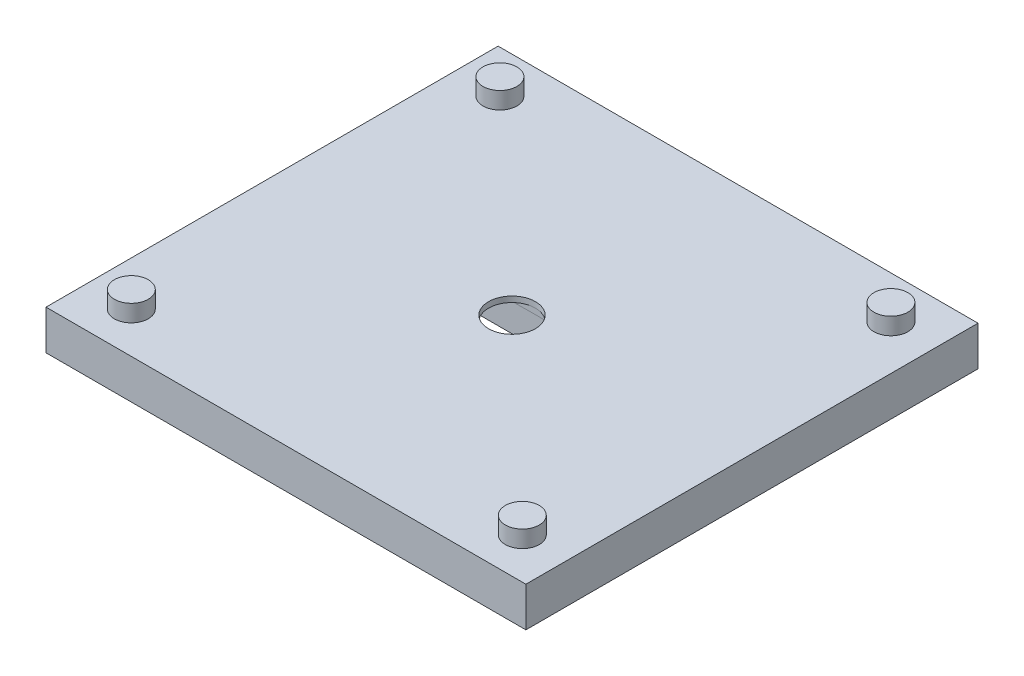
ISO-10303-21;
HEADER;
FILE_DESCRIPTION(('STEP AP214'),'2;1');
FILE_NAME('part.step','',(''),(''),'','','');
FILE_SCHEMA(('AUTOMOTIVE_DESIGN { 1 0 10303 214 1 1 1 1 }'));
ENDSEC;
DATA;
#1=APPLICATION_CONTEXT('core data for automotive mechanical design processes');
#2=APPLICATION_PROTOCOL_DEFINITION('international standard','automotive_design',2000,#1);
#3=PRODUCT_CONTEXT('',#1,'mechanical');
#4=PRODUCT('Part','Part','',(#3));
#5=PRODUCT_RELATED_PRODUCT_CATEGORY('part','',(#4));
#6=PRODUCT_DEFINITION_FORMATION('','',#4);
#7=PRODUCT_DEFINITION_CONTEXT('part definition',#1,'design');
#8=PRODUCT_DEFINITION('design','',#6,#7);
#9=PRODUCT_DEFINITION_SHAPE('','',#8);
#10=(LENGTH_UNIT() NAMED_UNIT(*) SI_UNIT(.MILLI.,.METRE.));
#11=(NAMED_UNIT(*) PLANE_ANGLE_UNIT() SI_UNIT($,.RADIAN.));
#12=(NAMED_UNIT(*) SI_UNIT($,.STERADIAN.) SOLID_ANGLE_UNIT());
#13=UNCERTAINTY_MEASURE_WITH_UNIT(LENGTH_MEASURE(1.E-05),#10,'distance_accuracy_value','');
#14=(GEOMETRIC_REPRESENTATION_CONTEXT(3) GLOBAL_UNCERTAINTY_ASSIGNED_CONTEXT((#13)) GLOBAL_UNIT_ASSIGNED_CONTEXT((#10,
#11,#12)) REPRESENTATION_CONTEXT('',''));
#15=CARTESIAN_POINT('',(0.,0.,0.));
#16=DIRECTION('',(0.,0.,1.));
#17=DIRECTION('',(1.,0.,0.));
#18=AXIS2_PLACEMENT_3D('',#15,#16,#17);
#19=CARTESIAN_POINT('',(0.,6.,0.));
#20=DIRECTION('',(0.,-1.,0.));
#21=DIRECTION('',(0.,0.,-1.));
#22=AXIS2_PLACEMENT_3D('',#19,#20,#21);
#23=PLANE('',#22);
#24=CARTESIAN_POINT('',(-1.96748391731383,6.,58.1171209400979));
#25=DIRECTION('',(0.,-1.,0.));
#26=DIRECTION('',(0.,0.,-1.));
#27=AXIS2_PLACEMENT_3D('',#24,#25,#26);
#28=CIRCLE('',#27,4.15);
#29=CARTESIAN_POINT('',(-1.96748391731383,6.,53.9671209400979));
#30=VERTEX_POINT('',#29);
#31=CARTESIAN_POINT('',(-1.96748391731383,6.,62.2671209400979));
#32=VERTEX_POINT('',#31);
#33=EDGE_CURVE('E56',#30,#32,#28,.T.);
#34=ORIENTED_EDGE('',*,*,#33,.F.);
#35=CARTESIAN_POINT('',(-1.96748391731383,6.,58.1171209400979));
#36=DIRECTION('',(0.,-1.,0.));
#37=DIRECTION('',(-1.,0.,0.));
#38=AXIS2_PLACEMENT_3D('',#35,#36,#37);
#39=ELLIPSE('',#38,39.,4.15);
#40=EDGE_CURVE('E130',#30,#32,#39,.T.);
#41=ORIENTED_EDGE('',*,*,#40,.T.);
#42=EDGE_LOOP('',(#34,#41));
#43=FACE_BOUND('',#42,.T.);
#44=ADVANCED_FACE('F39',(#43),#23,.T.);
#45=CARTESIAN_POINT('',(0.,5.,0.));
#46=DIRECTION('',(0.,-1.,0.));
#47=DIRECTION('',(0.,0.,-1.));
#48=AXIS2_PLACEMENT_3D('',#45,#46,#47);
#49=PLANE('',#48);
#50=CARTESIAN_POINT('',(-1.96748391731383,5.,58.1171209400979));
#51=DIRECTION('',(0.,-1.,0.));
#52=DIRECTION('',(-1.,0.,0.));
#53=AXIS2_PLACEMENT_3D('',#50,#51,#52);
#54=ELLIPSE('',#53,39.,4.15);
#55=CARTESIAN_POINT('',(-40.9674839173138,5.,58.1171209400979));
#56=VERTEX_POINT('',#55);
#57=CARTESIAN_POINT('',(-1.96748391731384,5.,53.9671209400979));
#58=VERTEX_POINT('',#57);
#59=EDGE_CURVE('E50',#56,#58,#54,.T.);
#60=ORIENTED_EDGE('',*,*,#59,.F.);
#61=DIRECTION('',(0.,0.,1.));
#62=VECTOR('',#61,1.);
#63=CARTESIAN_POINT('',(-40.9674839173138,5.,0.));
#64=LINE('',#63,#62);
#65=CARTESIAN_POINT('',(-40.9674839173138,5.,53.9671209400979));
#66=VERTEX_POINT('',#65);
#67=EDGE_CURVE('E477',#66,#56,#64,.T.);
#68=ORIENTED_EDGE('',*,*,#67,.F.);
#69=DIRECTION('',(1.,0.,0.));
#70=VECTOR('',#69,1.);
#71=CARTESIAN_POINT('',(0.,5.,53.9671209400979));
#72=LINE('',#71,#70);
#73=EDGE_CURVE('E475',#66,#58,#72,.T.);
#74=ORIENTED_EDGE('',*,*,#73,.T.);
#75=EDGE_LOOP('',(#60,#68,#74));
#76=FACE_BOUND('',#75,.T.);
#77=ADVANCED_FACE('F152',(#76),#49,.T.);
#78=CARTESIAN_POINT('',(37.0325160826862,5.,58.1171209400979));
#79=VERTEX_POINT('',#78);
#80=EDGE_CURVE('E11',#58,#79,#54,.T.);
#81=ORIENTED_EDGE('',*,*,#80,.F.);
#82=CARTESIAN_POINT('',(37.0325160826862,5.,53.9671209400979));
#83=VERTEX_POINT('',#82);
#84=EDGE_CURVE('E467',#58,#83,#72,.T.);
#85=ORIENTED_EDGE('',*,*,#84,.T.);
#86=DIRECTION('',(0.,0.,1.));
#87=VECTOR('',#86,1.);
#88=CARTESIAN_POINT('',(37.0325160826862,5.,0.));
#89=LINE('',#88,#87);
#90=EDGE_CURVE('E470',#83,#79,#89,.T.);
#91=ORIENTED_EDGE('',*,*,#90,.T.);
#92=EDGE_LOOP('',(#81,#85,#91));
#93=FACE_BOUND('',#92,.T.);
#94=ADVANCED_FACE('F227',(#93),#49,.T.);
#95=CARTESIAN_POINT('',(-1.96748391731383,5.,62.2671209400979));
#96=VERTEX_POINT('',#95);
#97=EDGE_CURVE('E48',#79,#96,#54,.T.);
#98=ORIENTED_EDGE('',*,*,#97,.F.);
#99=CARTESIAN_POINT('',(37.0325160826862,5.,62.2671209400979));
#100=VERTEX_POINT('',#99);
#101=EDGE_CURVE('E483',#79,#100,#89,.T.);
#102=ORIENTED_EDGE('',*,*,#101,.T.);
#103=DIRECTION('',(1.,0.,0.));
#104=VECTOR('',#103,1.);
#105=CARTESIAN_POINT('',(0.,5.,62.2671209400979));
#106=LINE('',#105,#104);
#107=EDGE_CURVE('E487',#96,#100,#106,.T.);
#108=ORIENTED_EDGE('',*,*,#107,.F.);
#109=EDGE_LOOP('',(#98,#102,#108));
#110=FACE_BOUND('',#109,.T.);
#111=ADVANCED_FACE('F153',(#110),#49,.T.);
#112=CARTESIAN_POINT('',(0.,0.,0.));
#113=DIRECTION('',(0.,-1.,0.));
#114=DIRECTION('',(0.,0.,-1.));
#115=AXIS2_PLACEMENT_3D('',#112,#113,#114);
#116=PLANE('',#115);
#117=DIRECTION('',(-1.,0.,0.));
#118=VECTOR('',#117,1.);
#119=CARTESIAN_POINT('',(-44.4257114828403,0.,18.1171209400979));
#120=LINE('',#119,#118);
#121=CARTESIAN_POINT('',(40.4907436482127,0.,18.1171209400979));
#122=VERTEX_POINT('',#121);
#123=CARTESIAN_POINT('',(-44.4257114828403,0.,18.1171209400979));
#124=VERTEX_POINT('',#123);
#125=EDGE_CURVE('E531',#122,#124,#120,.T.);
#126=ORIENTED_EDGE('',*,*,#125,.F.);
#127=DIRECTION('',(0.,0.,-1.));
#128=VECTOR('',#127,1.);
#129=CARTESIAN_POINT('',(40.4907436482127,0.,18.1171209400979));
#130=LINE('',#129,#128);
#131=CARTESIAN_POINT('',(40.4907436482127,0.,98.1171209400979));
#132=VERTEX_POINT('',#131);
#133=EDGE_CURVE('E536',#132,#122,#130,.T.);
#134=ORIENTED_EDGE('',*,*,#133,.F.);
#135=DIRECTION('',(1.,0.,0.));
#136=VECTOR('',#135,1.);
#137=CARTESIAN_POINT('',(-44.4257114828403,0.,98.1171209400979));
#138=LINE('',#137,#136);
#139=CARTESIAN_POINT('',(-44.4257114828403,0.,98.1171209400979));
#140=VERTEX_POINT('',#139);
#141=EDGE_CURVE('E547',#140,#132,#138,.T.);
#142=ORIENTED_EDGE('',*,*,#141,.F.);
#143=DIRECTION('',(0.,0.,1.));
#144=VECTOR('',#143,1.);
#145=CARTESIAN_POINT('',(-44.4257114828403,0.,18.1171209400979));
#146=LINE('',#145,#144);
#147=EDGE_CURVE('E545',#124,#140,#146,.T.);
#148=ORIENTED_EDGE('',*,*,#147,.F.);
#149=EDGE_LOOP('',(#126,#134,#142,#148));
#150=FACE_BOUND('',#149,.T.);
#151=DIRECTION('',(1.,0.,0.));
#152=VECTOR('',#151,1.);
#153=CARTESIAN_POINT('',(0.,0.,53.9671209400979));
#154=LINE('',#153,#152);
#155=CARTESIAN_POINT('',(-40.9674839173138,0.,53.9671209400979));
#156=VERTEX_POINT('',#155);
#157=CARTESIAN_POINT('',(37.0325160826862,0.,53.9671209400979));
#158=VERTEX_POINT('',#157);
#159=EDGE_CURVE('E138',#156,#158,#154,.T.);
#160=ORIENTED_EDGE('',*,*,#159,.F.);
#161=DIRECTION('',(0.,0.,1.));
#162=VECTOR('',#161,1.);
#163=CARTESIAN_POINT('',(-40.9674839173138,0.,0.));
#164=LINE('',#163,#162);
#165=CARTESIAN_POINT('',(-40.9674839173138,0.,62.2671209400979));
#166=VERTEX_POINT('',#165);
#167=EDGE_CURVE('E136',#156,#166,#164,.T.);
#168=ORIENTED_EDGE('',*,*,#167,.T.);
#169=DIRECTION('',(1.,0.,0.));
#170=VECTOR('',#169,1.);
#171=CARTESIAN_POINT('',(0.,0.,62.2671209400979));
#172=LINE('',#171,#170);
#173=CARTESIAN_POINT('',(37.0325160826862,0.,62.2671209400979));
#174=VERTEX_POINT('',#173);
#175=EDGE_CURVE('E496',#166,#174,#172,.T.);
#176=ORIENTED_EDGE('',*,*,#175,.T.);
#177=DIRECTION('',(0.,0.,1.));
#178=VECTOR('',#177,1.);
#179=CARTESIAN_POINT('',(37.0325160826862,0.,0.));
#180=LINE('',#179,#178);
#181=EDGE_CURVE('E493',#158,#174,#180,.T.);
#182=ORIENTED_EDGE('',*,*,#181,.F.);
#183=EDGE_LOOP('',(#160,#168,#176,#182));
#184=FACE_BOUND('',#183,.T.);
#185=ADVANCED_FACE('F205',(#150,#184),#116,.T.);
#186=CARTESIAN_POINT('',(0.,7.,0.));
#187=DIRECTION('',(0.,-1.,0.));
#188=DIRECTION('',(0.,0.,-1.));
#189=AXIS2_PLACEMENT_3D('',#186,#187,#188);
#190=PLANE('',#189);
#191=CARTESIAN_POINT('',(-1.96748391731383,7.,58.1171209400979));
#192=DIRECTION('',(0.,-1.,0.));
#193=DIRECTION('',(0.,0.,-1.));
#194=AXIS2_PLACEMENT_3D('',#191,#192,#193);
#195=CIRCLE('',#194,4.15);
#196=CARTESIAN_POINT('',(-1.96748391731383,7.,53.9671209400979));
#197=VERTEX_POINT('',#196);
#198=EDGE_CURVE('E43',#197,#197,#195,.T.);
#199=ORIENTED_EDGE('',*,*,#198,.T.);
#200=EDGE_LOOP('',(#199));
#201=FACE_BOUND('',#200,.T.);
#202=DIRECTION('',(-1.,0.,0.));
#203=VECTOR('',#202,1.);
#204=CARTESIAN_POINT('',(-44.4257114828403,7.,18.1171209400979));
#205=LINE('',#204,#203);
#206=CARTESIAN_POINT('',(40.4907436482127,7.,18.1171209400979));
#207=VERTEX_POINT('',#206);
#208=CARTESIAN_POINT('',(-44.4257114828403,7.,18.1171209400979));
#209=VERTEX_POINT('',#208);
#210=EDGE_CURVE('E532',#207,#209,#205,.T.);
#211=ORIENTED_EDGE('',*,*,#210,.T.);
#212=DIRECTION('',(0.,0.,1.));
#213=VECTOR('',#212,1.);
#214=CARTESIAN_POINT('',(-44.4257114828403,7.,18.1171209400979));
#215=LINE('',#214,#213);
#216=CARTESIAN_POINT('',(-44.4257114828403,7.,98.1171209400979));
#217=VERTEX_POINT('',#216);
#218=EDGE_CURVE('E535',#209,#217,#215,.T.);
#219=ORIENTED_EDGE('',*,*,#218,.T.);
#220=DIRECTION('',(1.,0.,0.));
#221=VECTOR('',#220,1.);
#222=CARTESIAN_POINT('',(-44.4257114828403,7.,98.1171209400979));
#223=LINE('',#222,#221);
#224=CARTESIAN_POINT('',(40.4907436482127,7.,98.1171209400979));
#225=VERTEX_POINT('',#224);
#226=EDGE_CURVE('E538',#217,#225,#223,.T.);
#227=ORIENTED_EDGE('',*,*,#226,.T.);
#228=DIRECTION('',(0.,0.,-1.));
#229=VECTOR('',#228,1.);
#230=CARTESIAN_POINT('',(40.4907436482127,7.,18.1171209400979));
#231=LINE('',#230,#229);
#232=EDGE_CURVE('E540',#225,#207,#231,.T.);
#233=ORIENTED_EDGE('',*,*,#232,.T.);
#234=EDGE_LOOP('',(#211,#219,#227,#233));
#235=FACE_BOUND('',#234,.T.);
#236=CARTESIAN_POINT('',(-36.5850717066579,7.,25.6363490732059));
#237=DIRECTION('',(0.,1.,0.));
#238=DIRECTION('',(0.,0.,1.));
#239=AXIS2_PLACEMENT_3D('',#236,#237,#238);
#240=CIRCLE('',#239,3.00000000000001);
#241=CARTESIAN_POINT('',(-36.5850717066579,7.,28.6363490732059));
#242=VERTEX_POINT('',#241);
#243=EDGE_CURVE('E528',#242,#242,#240,.T.);
#244=ORIENTED_EDGE('',*,*,#243,.F.);
#245=EDGE_LOOP('',(#244));
#246=FACE_BOUND('',#245,.T.);
#247=CARTESIAN_POINT('',(32.6016130829819,7.,25.6363490732059));
#248=DIRECTION('',(0.,1.,0.));
#249=DIRECTION('',(0.,0.,1.));
#250=AXIS2_PLACEMENT_3D('',#247,#248,#249);
#251=CIRCLE('',#250,3.);
#252=CARTESIAN_POINT('',(32.6016130829819,7.,28.6363490732059));
#253=VERTEX_POINT('',#252);
#254=EDGE_CURVE('E525',#253,#253,#251,.T.);
#255=ORIENTED_EDGE('',*,*,#254,.F.);
#256=EDGE_LOOP('',(#255));
#257=FACE_BOUND('',#256,.T.);
#258=CARTESIAN_POINT('',(-36.5850717066579,7.,90.8619641229808));
#259=DIRECTION('',(0.,1.,0.));
#260=DIRECTION('',(0.,0.,1.));
#261=AXIS2_PLACEMENT_3D('',#258,#259,#260);
#262=CIRCLE('',#261,3.00000000000001);
#263=CARTESIAN_POINT('',(-36.5850717066579,7.,93.8619641229808));
#264=VERTEX_POINT('',#263);
#265=EDGE_CURVE('E522',#264,#264,#262,.T.);
#266=ORIENTED_EDGE('',*,*,#265,.F.);
#267=EDGE_LOOP('',(#266));
#268=FACE_BOUND('',#267,.T.);
#269=CARTESIAN_POINT('',(32.6016130829819,7.,90.8619641229808));
#270=DIRECTION('',(0.,1.,0.));
#271=DIRECTION('',(0.,0.,1.));
#272=AXIS2_PLACEMENT_3D('',#269,#270,#271);
#273=CIRCLE('',#272,3.00000000000001);
#274=CARTESIAN_POINT('',(32.6016130829819,7.,93.8619641229808));
#275=VERTEX_POINT('',#274);
#276=EDGE_CURVE('E519',#275,#275,#273,.T.);
#277=ORIENTED_EDGE('',*,*,#276,.F.);
#278=EDGE_LOOP('',(#277));
#279=FACE_BOUND('',#278,.T.);
#280=ADVANCED_FACE('F202',(#201,#235,#246,#257,#268,#279),#190,.F.);
#281=CARTESIAN_POINT('',(-44.4257114828403,7.,18.1171209400979));
#282=DIRECTION('',(0.,0.,1.));
#283=DIRECTION('',(1.,0.,0.));
#284=AXIS2_PLACEMENT_3D('',#281,#282,#283);
#285=PLANE('',#284);
#286=ORIENTED_EDGE('',*,*,#125,.T.);
#287=DIRECTION('',(0.,-1.,0.));
#288=VECTOR('',#287,1.);
#289=CARTESIAN_POINT('',(-44.4257114828403,7.,18.1171209400979));
#290=LINE('',#289,#288);
#291=EDGE_CURVE('E557',#209,#124,#290,.T.);
#292=ORIENTED_EDGE('',*,*,#291,.F.);
#293=ORIENTED_EDGE('',*,*,#210,.F.);
#294=DIRECTION('',(0.,-1.,0.));
#295=VECTOR('',#294,1.);
#296=CARTESIAN_POINT('',(40.4907436482127,7.,18.1171209400979));
#297=LINE('',#296,#295);
#298=EDGE_CURVE('E542',#207,#122,#297,.T.);
#299=ORIENTED_EDGE('',*,*,#298,.T.);
#300=EDGE_LOOP('',(#286,#292,#293,#299));
#301=FACE_BOUND('',#300,.T.);
#302=ADVANCED_FACE('F41',(#301),#285,.F.);
#303=CARTESIAN_POINT('',(-44.4257114828403,7.,18.1171209400979));
#304=DIRECTION('',(1.,0.,0.));
#305=DIRECTION('',(0.,0.,-1.));
#306=AXIS2_PLACEMENT_3D('',#303,#304,#305);
#307=PLANE('',#306);
#308=ORIENTED_EDGE('',*,*,#147,.T.);
#309=DIRECTION('',(0.,-1.,0.));
#310=VECTOR('',#309,1.);
#311=CARTESIAN_POINT('',(-44.4257114828403,7.,98.1171209400979));
#312=LINE('',#311,#310);
#313=EDGE_CURVE('E555',#217,#140,#312,.T.);
#314=ORIENTED_EDGE('',*,*,#313,.F.);
#315=ORIENTED_EDGE('',*,*,#218,.F.);
#316=ORIENTED_EDGE('',*,*,#291,.T.);
#317=EDGE_LOOP('',(#308,#314,#315,#316));
#318=FACE_BOUND('',#317,.T.);
#319=ADVANCED_FACE('F215',(#318),#307,.F.);
#320=CARTESIAN_POINT('',(-44.4257114828403,7.,98.1171209400979));
#321=DIRECTION('',(0.,0.,-1.));
#322=DIRECTION('',(-1.,0.,0.));
#323=AXIS2_PLACEMENT_3D('',#320,#321,#322);
#324=PLANE('',#323);
#325=ORIENTED_EDGE('',*,*,#141,.T.);
#326=DIRECTION('',(0.,-1.,0.));
#327=VECTOR('',#326,1.);
#328=CARTESIAN_POINT('',(40.4907436482127,7.,98.1171209400979));
#329=LINE('',#328,#327);
#330=EDGE_CURVE('E552',#225,#132,#329,.T.);
#331=ORIENTED_EDGE('',*,*,#330,.F.);
#332=ORIENTED_EDGE('',*,*,#226,.F.);
#333=ORIENTED_EDGE('',*,*,#313,.T.);
#334=EDGE_LOOP('',(#325,#331,#332,#333));
#335=FACE_BOUND('',#334,.T.);
#336=ADVANCED_FACE('F212',(#335),#324,.F.);
#337=CARTESIAN_POINT('',(40.4907436482127,7.,18.1171209400979));
#338=DIRECTION('',(-1.,0.,0.));
#339=DIRECTION('',(0.,0.,1.));
#340=AXIS2_PLACEMENT_3D('',#337,#338,#339);
#341=PLANE('',#340);
#342=ORIENTED_EDGE('',*,*,#133,.T.);
#343=ORIENTED_EDGE('',*,*,#298,.F.);
#344=ORIENTED_EDGE('',*,*,#232,.F.);
#345=ORIENTED_EDGE('',*,*,#330,.T.);
#346=EDGE_LOOP('',(#342,#343,#344,#345));
#347=FACE_BOUND('',#346,.T.);
#348=ADVANCED_FACE('F200',(#347),#341,.F.);
#349=CARTESIAN_POINT('',(-36.5850717066579,0.,25.6363490732059));
#350=DIRECTION('',(0.,1.,0.));
#351=DIRECTION('',(0.,0.,1.));
#352=AXIS2_PLACEMENT_3D('',#349,#350,#351);
#353=CYLINDRICAL_SURFACE('',#352,3.00000000000001);
#354=CARTESIAN_POINT('',(-36.5850717066579,10.,25.6363490732059));
#355=DIRECTION('',(0.,1.,0.));
#356=DIRECTION('',(0.,0.,1.));
#357=AXIS2_PLACEMENT_3D('',#354,#355,#356);
#358=CIRCLE('',#357,3.00000000000001);
#359=CARTESIAN_POINT('',(-36.5850717066579,10.,28.6363490732059));
#360=VERTEX_POINT('',#359);
#361=EDGE_CURVE('E516',#360,#360,#358,.T.);
#362=ORIENTED_EDGE('',*,*,#361,.F.);
#363=EDGE_LOOP('',(#362));
#364=FACE_BOUND('',#363,.T.);
#365=ORIENTED_EDGE('',*,*,#243,.T.);
#366=EDGE_LOOP('',(#365));
#367=FACE_BOUND('',#366,.T.);
#368=ADVANCED_FACE('F196',(#364,#367),#353,.T.);
#369=CARTESIAN_POINT('',(-36.5850717066579,10.,25.6363490732059));
#370=DIRECTION('',(0.,1.,0.));
#371=DIRECTION('',(0.,0.,1.));
#372=AXIS2_PLACEMENT_3D('',#369,#370,#371);
#373=PLANE('',#372);
#374=ORIENTED_EDGE('',*,*,#361,.T.);
#375=EDGE_LOOP('',(#374));
#376=FACE_BOUND('',#375,.T.);
#377=ADVANCED_FACE('F189',(#376),#373,.T.);
#378=CARTESIAN_POINT('',(32.6016130829819,0.,25.6363490732059));
#379=DIRECTION('',(0.,1.,0.));
#380=DIRECTION('',(0.,0.,1.));
#381=AXIS2_PLACEMENT_3D('',#378,#379,#380);
#382=CYLINDRICAL_SURFACE('',#381,3.);
#383=CARTESIAN_POINT('',(32.6016130829819,10.,25.6363490732059));
#384=DIRECTION('',(0.,1.,0.));
#385=DIRECTION('',(0.,0.,1.));
#386=AXIS2_PLACEMENT_3D('',#383,#384,#385);
#387=CIRCLE('',#386,3.);
#388=CARTESIAN_POINT('',(32.6016130829819,10.,28.6363490732059));
#389=VERTEX_POINT('',#388);
#390=EDGE_CURVE('E513',#389,#389,#387,.T.);
#391=ORIENTED_EDGE('',*,*,#390,.F.);
#392=EDGE_LOOP('',(#391));
#393=FACE_BOUND('',#392,.T.);
#394=ORIENTED_EDGE('',*,*,#254,.T.);
#395=EDGE_LOOP('',(#394));
#396=FACE_BOUND('',#395,.T.);
#397=ADVANCED_FACE('F186',(#393,#396),#382,.T.);
#398=CARTESIAN_POINT('',(32.6016130829819,10.,25.6363490732059));
#399=DIRECTION('',(0.,1.,0.));
#400=DIRECTION('',(0.,0.,1.));
#401=AXIS2_PLACEMENT_3D('',#398,#399,#400);
#402=PLANE('',#401);
#403=ORIENTED_EDGE('',*,*,#390,.T.);
#404=EDGE_LOOP('',(#403));
#405=FACE_BOUND('',#404,.T.);
#406=ADVANCED_FACE('F181',(#405),#402,.T.);
#407=CARTESIAN_POINT('',(-36.5850717066579,0.,90.8619641229808));
#408=DIRECTION('',(0.,1.,0.));
#409=DIRECTION('',(0.,0.,1.));
#410=AXIS2_PLACEMENT_3D('',#407,#408,#409);
#411=CYLINDRICAL_SURFACE('',#410,3.);
#412=CARTESIAN_POINT('',(-36.5850717066579,10.,90.8619641229808));
#413=DIRECTION('',(0.,1.,0.));
#414=DIRECTION('',(0.,0.,1.));
#415=AXIS2_PLACEMENT_3D('',#412,#413,#414);
#416=CIRCLE('',#415,3.);
#417=CARTESIAN_POINT('',(-36.5850717066579,10.,93.8619641229808));
#418=VERTEX_POINT('',#417);
#419=EDGE_CURVE('E510',#418,#418,#416,.T.);
#420=ORIENTED_EDGE('',*,*,#419,.F.);
#421=EDGE_LOOP('',(#420));
#422=FACE_BOUND('',#421,.T.);
#423=ORIENTED_EDGE('',*,*,#265,.T.);
#424=EDGE_LOOP('',(#423));
#425=FACE_BOUND('',#424,.T.);
#426=ADVANCED_FACE('F178',(#422,#425),#411,.T.);
#427=CARTESIAN_POINT('',(-36.5850717066579,10.,90.8619641229808));
#428=DIRECTION('',(0.,1.,0.));
#429=DIRECTION('',(0.,0.,1.));
#430=AXIS2_PLACEMENT_3D('',#427,#428,#429);
#431=PLANE('',#430);
#432=ORIENTED_EDGE('',*,*,#419,.T.);
#433=EDGE_LOOP('',(#432));
#434=FACE_BOUND('',#433,.T.);
#435=ADVANCED_FACE('F173',(#434),#431,.T.);
#436=CARTESIAN_POINT('',(32.6016130829819,0.,90.8619641229808));
#437=DIRECTION('',(0.,1.,0.));
#438=DIRECTION('',(0.,0.,1.));
#439=AXIS2_PLACEMENT_3D('',#436,#437,#438);
#440=CYLINDRICAL_SURFACE('',#439,3.);
#441=CARTESIAN_POINT('',(32.6016130829819,10.,90.8619641229808));
#442=DIRECTION('',(0.,1.,0.));
#443=DIRECTION('',(0.,0.,1.));
#444=AXIS2_PLACEMENT_3D('',#441,#442,#443);
#445=CIRCLE('',#444,3.);
#446=CARTESIAN_POINT('',(32.6016130829819,10.,93.8619641229808));
#447=VERTEX_POINT('',#446);
#448=EDGE_CURVE('E503',#447,#447,#445,.T.);
#449=ORIENTED_EDGE('',*,*,#448,.F.);
#450=EDGE_LOOP('',(#449));
#451=FACE_BOUND('',#450,.T.);
#452=ORIENTED_EDGE('',*,*,#276,.T.);
#453=EDGE_LOOP('',(#452));
#454=FACE_BOUND('',#453,.T.);
#455=ADVANCED_FACE('F170',(#451,#454),#440,.T.);
#456=CARTESIAN_POINT('',(32.6016130829819,10.,90.8619641229808));
#457=DIRECTION('',(0.,1.,0.));
#458=DIRECTION('',(0.,0.,1.));
#459=AXIS2_PLACEMENT_3D('',#456,#457,#458);
#460=PLANE('',#459);
#461=ORIENTED_EDGE('',*,*,#448,.T.);
#462=EDGE_LOOP('',(#461));
#463=FACE_BOUND('',#462,.T.);
#464=ADVANCED_FACE('F168',(#463),#460,.T.);
#465=CARTESIAN_POINT('',(-40.9674839173138,5.,0.));
#466=DIRECTION('',(1.,0.,0.));
#467=DIRECTION('',(0.,0.,-1.));
#468=AXIS2_PLACEMENT_3D('',#465,#466,#467);
#469=PLANE('',#468);
#470=ORIENTED_EDGE('',*,*,#167,.F.);
#471=DIRECTION('',(0.,-1.,0.));
#472=VECTOR('',#471,1.);
#473=CARTESIAN_POINT('',(-40.9674839173138,5.,53.9671209400979));
#474=LINE('',#473,#472);
#475=EDGE_CURVE('E490',#66,#156,#474,.T.);
#476=ORIENTED_EDGE('',*,*,#475,.F.);
#477=ORIENTED_EDGE('',*,*,#67,.T.);
#478=CARTESIAN_POINT('',(-40.9674839173138,5.,62.2671209400979));
#479=VERTEX_POINT('',#478);
#480=EDGE_CURVE('E499',#56,#479,#64,.T.);
#481=ORIENTED_EDGE('',*,*,#480,.T.);
#482=DIRECTION('',(0.,-1.,0.));
#483=VECTOR('',#482,1.);
#484=CARTESIAN_POINT('',(-40.9674839173138,5.,62.2671209400979));
#485=LINE('',#484,#483);
#486=EDGE_CURVE('E500',#479,#166,#485,.T.);
#487=ORIENTED_EDGE('',*,*,#486,.T.);
#488=EDGE_LOOP('',(#470,#476,#477,#481,#487));
#489=FACE_BOUND('',#488,.T.);
#490=ADVANCED_FACE('F158',(#489),#469,.T.);
#491=CARTESIAN_POINT('',(0.,5.,62.2671209400979));
#492=DIRECTION('',(0.,0.,-1.));
#493=DIRECTION('',(-1.,0.,0.));
#494=AXIS2_PLACEMENT_3D('',#491,#492,#493);
#495=PLANE('',#494);
#496=ORIENTED_EDGE('',*,*,#175,.F.);
#497=ORIENTED_EDGE('',*,*,#486,.F.);
#498=EDGE_CURVE('E488',#479,#96,#106,.T.);
#499=ORIENTED_EDGE('',*,*,#498,.T.);
#500=ORIENTED_EDGE('',*,*,#107,.T.);
#501=DIRECTION('',(0.,-1.,0.));
#502=VECTOR('',#501,1.);
#503=CARTESIAN_POINT('',(37.0325160826862,5.,62.2671209400979));
#504=LINE('',#503,#502);
#505=EDGE_CURVE('E504',#100,#174,#504,.T.);
#506=ORIENTED_EDGE('',*,*,#505,.T.);
#507=EDGE_LOOP('',(#496,#497,#499,#500,#506));
#508=FACE_BOUND('',#507,.T.);
#509=ADVANCED_FACE('F154',(#508),#495,.T.);
#510=CARTESIAN_POINT('',(37.0325160826862,5.,0.));
#511=DIRECTION('',(1.,0.,0.));
#512=DIRECTION('',(0.,0.,-1.));
#513=AXIS2_PLACEMENT_3D('',#510,#511,#512);
#514=PLANE('',#513);
#515=ORIENTED_EDGE('',*,*,#181,.T.);
#516=ORIENTED_EDGE('',*,*,#505,.F.);
#517=ORIENTED_EDGE('',*,*,#101,.F.);
#518=ORIENTED_EDGE('',*,*,#90,.F.);
#519=DIRECTION('',(0.,-1.,0.));
#520=VECTOR('',#519,1.);
#521=CARTESIAN_POINT('',(37.0325160826862,5.,53.9671209400979));
#522=LINE('',#521,#520);
#523=EDGE_CURVE('E476',#83,#158,#522,.T.);
#524=ORIENTED_EDGE('',*,*,#523,.T.);
#525=EDGE_LOOP('',(#515,#516,#517,#518,#524));
#526=FACE_BOUND('',#525,.T.);
#527=ADVANCED_FACE('F157',(#526),#514,.F.);
#528=CARTESIAN_POINT('',(0.,5.,53.9671209400979));
#529=DIRECTION('',(0.,0.,-1.));
#530=DIRECTION('',(-1.,0.,0.));
#531=AXIS2_PLACEMENT_3D('',#528,#529,#530);
#532=PLANE('',#531);
#533=ORIENTED_EDGE('',*,*,#159,.T.);
#534=ORIENTED_EDGE('',*,*,#523,.F.);
#535=ORIENTED_EDGE('',*,*,#84,.F.);
#536=ORIENTED_EDGE('',*,*,#73,.F.);
#537=ORIENTED_EDGE('',*,*,#475,.T.);
#538=EDGE_LOOP('',(#533,#534,#535,#536,#537));
#539=FACE_BOUND('',#538,.T.);
#540=ADVANCED_FACE('F150',(#539),#532,.F.);
#541=EDGE_CURVE('E559',#96,#56,#54,.T.);
#542=ORIENTED_EDGE('',*,*,#541,.F.);
#543=ORIENTED_EDGE('',*,*,#498,.F.);
#544=ORIENTED_EDGE('',*,*,#480,.F.);
#545=EDGE_LOOP('',(#542,#543,#544));
#546=FACE_BOUND('',#545,.T.);
#547=ADVANCED_FACE('F146',(#546),#49,.T.);
#548=DIRECTION('',(0.,-1.,0.));
#549=VECTOR('',#548,1.);
#550=SURFACE_OF_LINEAR_EXTRUSION('',#39,#549);
#551=ORIENTED_EDGE('',*,*,#40,.F.);
#552=EDGE_CURVE('E131',#32,#30,#39,.T.);
#553=ORIENTED_EDGE('',*,*,#552,.F.);
#554=EDGE_LOOP('',(#551,#553));
#555=FACE_BOUND('',#554,.T.);
#556=ORIENTED_EDGE('',*,*,#59,.T.);
#557=ORIENTED_EDGE('',*,*,#80,.T.);
#558=ORIENTED_EDGE('',*,*,#97,.T.);
#559=ORIENTED_EDGE('',*,*,#541,.T.);
#560=EDGE_LOOP('',(#556,#557,#558,#559));
#561=FACE_BOUND('',#560,.T.);
#562=ADVANCED_FACE('F135',(#555,#561),#550,.F.);
#563=EDGE_CURVE('E120',#32,#30,#28,.T.);
#564=ORIENTED_EDGE('',*,*,#563,.F.);
#565=ORIENTED_EDGE('',*,*,#552,.T.);
#566=EDGE_LOOP('',(#564,#565));
#567=FACE_BOUND('',#566,.T.);
#568=ADVANCED_FACE('F132',(#567),#23,.T.);
#569=CARTESIAN_POINT('',(-1.96748391731383,10.,58.1171209400979));
#570=DIRECTION('',(0.,-1.,0.));
#571=DIRECTION('',(0.,0.,-1.));
#572=AXIS2_PLACEMENT_3D('',#569,#570,#571);
#573=CYLINDRICAL_SURFACE('',#572,4.15);
#574=ORIENTED_EDGE('',*,*,#33,.T.);
#575=ORIENTED_EDGE('',*,*,#563,.T.);
#576=EDGE_LOOP('',(#574,#575));
#577=FACE_BOUND('',#576,.T.);
#578=ORIENTED_EDGE('',*,*,#198,.F.);
#579=EDGE_LOOP('',(#578));
#580=FACE_BOUND('',#579,.T.);
#581=ADVANCED_FACE('F121',(#577,#580),#573,.F.);
#582=CLOSED_SHELL('',(#44,#77,#94,#111,#185,#280,#302,#319,#336,#348,#368,#377,#397,#406,#426,
#435,#455,#464,#490,#509,#527,#540,#547,#562,#568,#581));
#583=MANIFOLD_SOLID_BREP('B2',#582);
#584=ADVANCED_BREP_SHAPE_REPRESENTATION('',(#18,#583),#14);
#585=SHAPE_DEFINITION_REPRESENTATION(#9,#584);
ENDSEC;
END-ISO-10303-21;
